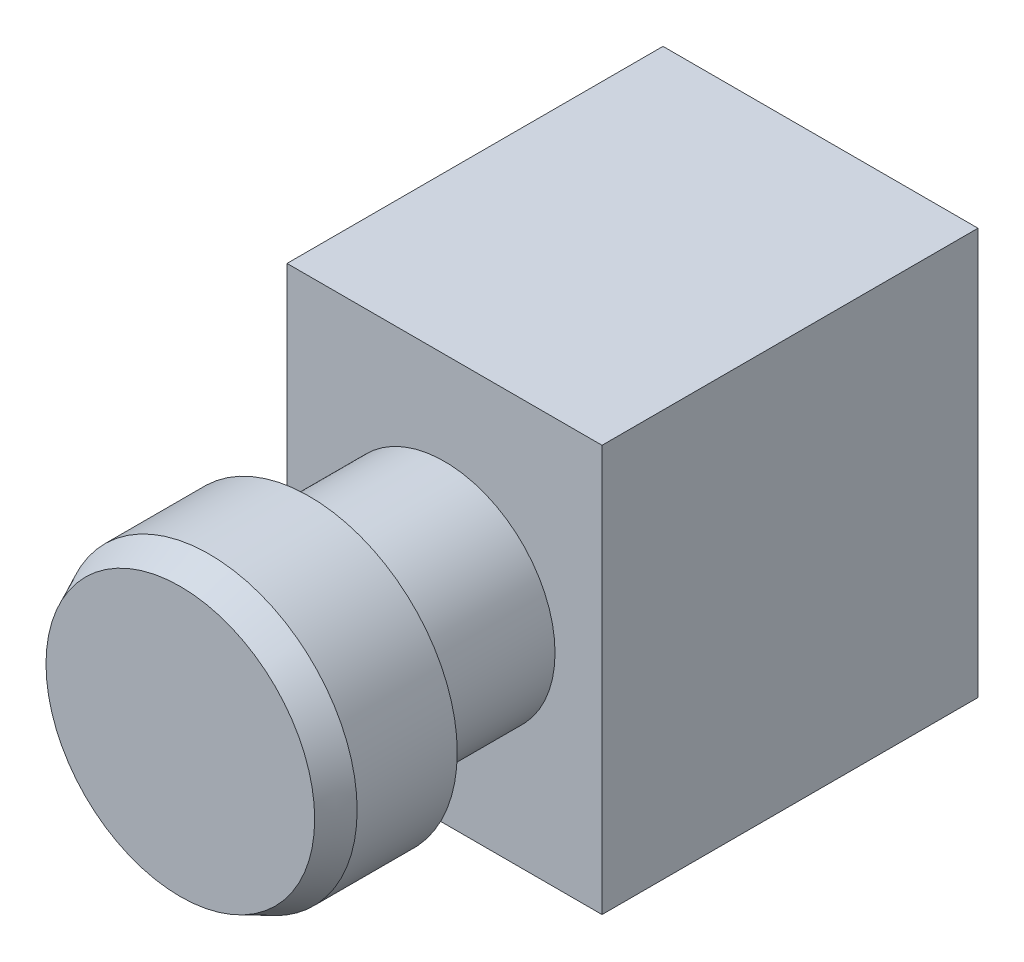
ISO-10303-21;
HEADER;
FILE_DESCRIPTION(('STEP AP214'),'2;1');
FILE_NAME('part.step','',(''),(''),'','','');
FILE_SCHEMA(('AUTOMOTIVE_DESIGN { 1 0 10303 214 1 1 1 1 }'));
ENDSEC;
DATA;
#1=APPLICATION_CONTEXT('core data for automotive mechanical design processes');
#2=APPLICATION_PROTOCOL_DEFINITION('international standard','automotive_design',2000,#1);
#3=PRODUCT_CONTEXT('',#1,'mechanical');
#4=PRODUCT('Part','Part','',(#3));
#5=PRODUCT_RELATED_PRODUCT_CATEGORY('part','',(#4));
#6=PRODUCT_DEFINITION_FORMATION('','',#4);
#7=PRODUCT_DEFINITION_CONTEXT('part definition',#1,'design');
#8=PRODUCT_DEFINITION('design','',#6,#7);
#9=PRODUCT_DEFINITION_SHAPE('','',#8);
#10=(LENGTH_UNIT() NAMED_UNIT(*) SI_UNIT(.MILLI.,.METRE.));
#11=(NAMED_UNIT(*) PLANE_ANGLE_UNIT() SI_UNIT($,.RADIAN.));
#12=(NAMED_UNIT(*) SI_UNIT($,.STERADIAN.) SOLID_ANGLE_UNIT());
#13=UNCERTAINTY_MEASURE_WITH_UNIT(LENGTH_MEASURE(1.E-05),#10,'distance_accuracy_value','');
#14=(GEOMETRIC_REPRESENTATION_CONTEXT(3) GLOBAL_UNCERTAINTY_ASSIGNED_CONTEXT((#13)) GLOBAL_UNIT_ASSIGNED_CONTEXT((#10,
#11,#12)) REPRESENTATION_CONTEXT('',''));
#15=CARTESIAN_POINT('',(0.,0.,0.));
#16=DIRECTION('',(0.,0.,1.));
#17=DIRECTION('',(1.,0.,0.));
#18=AXIS2_PLACEMENT_3D('',#15,#16,#17);
#19=CARTESIAN_POINT('',(0.,0.,9.85));
#20=DIRECTION('',(0.,0.,-1.));
#21=DIRECTION('',(-1.,0.,0.));
#22=AXIS2_PLACEMENT_3D('',#19,#20,#21);
#23=CYLINDRICAL_SURFACE('',#22,14.55);
#24=CARTESIAN_POINT('',(0.,0.,9.85));
#25=DIRECTION('',(0.,0.,1.));
#26=DIRECTION('',(1.,0.,0.));
#27=AXIS2_PLACEMENT_3D('',#24,#25,#26);
#28=CIRCLE('',#27,14.55);
#29=CARTESIAN_POINT('',(14.55,0.,9.85));
#30=VERTEX_POINT('',#29);
#31=EDGE_CURVE('E11',#30,#30,#28,.T.);
#32=ORIENTED_EDGE('',*,*,#31,.F.);
#33=EDGE_LOOP('',(#32));
#34=FACE_BOUND('',#33,.T.);
#35=CARTESIAN_POINT('',(0.,0.,0.));
#36=DIRECTION('',(0.,0.,1.));
#37=DIRECTION('',(1.,0.,0.));
#38=AXIS2_PLACEMENT_3D('',#35,#36,#37);
#39=CIRCLE('',#38,14.55);
#40=CARTESIAN_POINT('',(14.55,0.,0.));
#41=VERTEX_POINT('',#40);
#42=EDGE_CURVE('E49',#41,#41,#39,.T.);
#43=ORIENTED_EDGE('',*,*,#42,.T.);
#44=EDGE_LOOP('',(#43));
#45=FACE_BOUND('',#44,.T.);
#46=ADVANCED_FACE('F50',(#34,#45),#23,.T.);
#47=CARTESIAN_POINT('',(0.,0.,0.));
#48=DIRECTION('',(0.,0.,1.));
#49=DIRECTION('',(1.,0.,0.));
#50=AXIS2_PLACEMENT_3D('',#47,#48,#49);
#51=PLANE('',#50);
#52=CARTESIAN_POINT('',(0.,0.,0.));
#53=DIRECTION('',(0.,0.,1.));
#54=DIRECTION('',(1.,0.,0.));
#55=AXIS2_PLACEMENT_3D('',#52,#53,#54);
#56=CIRCLE('',#55,10.875);
#57=CARTESIAN_POINT('',(10.875,0.,0.));
#58=VERTEX_POINT('',#57);
#59=EDGE_CURVE('E126',#58,#58,#56,.T.);
#60=ORIENTED_EDGE('',*,*,#59,.T.);
#61=EDGE_LOOP('',(#60));
#62=FACE_BOUND('',#61,.T.);
#63=ORIENTED_EDGE('',*,*,#42,.F.);
#64=EDGE_LOOP('',(#63));
#65=FACE_BOUND('',#64,.T.);
#66=ADVANCED_FACE('F139',(#62,#65),#51,.F.);
#67=CARTESIAN_POINT('',(0.,0.,9.85));
#68=DIRECTION('',(0.,0.,-1.));
#69=DIRECTION('',(1.,0.,0.));
#70=AXIS2_PLACEMENT_3D('',#67,#68,#69);
#71=CONICAL_SURFACE('',#70,14.55,0.436332312998583);
#72=CARTESIAN_POINT('',(0.,0.,12.7));
#73=DIRECTION('',(0.,0.,1.));
#74=DIRECTION('',(1.,0.,0.));
#75=AXIS2_PLACEMENT_3D('',#72,#73,#74);
#76=CIRCLE('',#75,13.2210231742583);
#77=CARTESIAN_POINT('',(13.2210231742583,0.,12.7));
#78=VERTEX_POINT('',#77);
#79=EDGE_CURVE('E132',#78,#78,#76,.T.);
#80=ORIENTED_EDGE('',*,*,#79,.F.);
#81=EDGE_LOOP('',(#80));
#82=FACE_BOUND('',#81,.T.);
#83=ORIENTED_EDGE('',*,*,#31,.T.);
#84=EDGE_LOOP('',(#83));
#85=FACE_BOUND('',#84,.T.);
#86=ADVANCED_FACE('F143',(#82,#85),#71,.T.);
#87=CARTESIAN_POINT('',(0.,0.,12.7));
#88=DIRECTION('',(0.,0.,1.));
#89=DIRECTION('',(1.,0.,0.));
#90=AXIS2_PLACEMENT_3D('',#87,#88,#89);
#91=PLANE('',#90);
#92=ORIENTED_EDGE('',*,*,#79,.T.);
#93=EDGE_LOOP('',(#92));
#94=FACE_BOUND('',#93,.T.);
#95=ADVANCED_FACE('F146',(#94),#91,.T.);
#96=CARTESIAN_POINT('',(0.,0.,-13.3));
#97=DIRECTION('',(0.,0.,1.));
#98=DIRECTION('',(1.,0.,0.));
#99=AXIS2_PLACEMENT_3D('',#96,#97,#98);
#100=CYLINDRICAL_SURFACE('',#99,10.875);
#101=CARTESIAN_POINT('',(0.,0.,-13.3));
#102=DIRECTION('',(0.,0.,1.));
#103=DIRECTION('',(1.,0.,0.));
#104=AXIS2_PLACEMENT_3D('',#101,#102,#103);
#105=CIRCLE('',#104,10.875);
#106=CARTESIAN_POINT('',(10.875,0.,-13.3));
#107=VERTEX_POINT('',#106);
#108=EDGE_CURVE('E125',#107,#107,#105,.T.);
#109=ORIENTED_EDGE('',*,*,#108,.T.);
#110=EDGE_LOOP('',(#109));
#111=FACE_BOUND('',#110,.T.);
#112=ORIENTED_EDGE('',*,*,#59,.F.);
#113=EDGE_LOOP('',(#112));
#114=FACE_BOUND('',#113,.T.);
#115=ADVANCED_FACE('F156',(#111,#114),#100,.T.);
#116=CARTESIAN_POINT('',(15.5,-20.,-50.3));
#117=DIRECTION('',(1.,0.,0.));
#118=DIRECTION('',(0.,0.,-1.));
#119=AXIS2_PLACEMENT_3D('',#116,#117,#118);
#120=PLANE('',#119);
#121=DIRECTION('',(0.,1.,0.));
#122=VECTOR('',#121,1.);
#123=CARTESIAN_POINT('',(15.5,-20.,-13.3));
#124=LINE('',#123,#122);
#125=CARTESIAN_POINT('',(15.5,-20.,-13.3));
#126=VERTEX_POINT('',#125);
#127=CARTESIAN_POINT('',(15.5,20.,-13.3));
#128=VERTEX_POINT('',#127);
#129=EDGE_CURVE('E111',#126,#128,#124,.T.);
#130=ORIENTED_EDGE('',*,*,#129,.F.);
#131=DIRECTION('',(0.,0.,1.));
#132=VECTOR('',#131,1.);
#133=CARTESIAN_POINT('',(15.5,-20.,-50.3));
#134=LINE('',#133,#132);
#135=CARTESIAN_POINT('',(15.5,-20.,-50.3));
#136=VERTEX_POINT('',#135);
#137=EDGE_CURVE('E63',#136,#126,#134,.T.);
#138=ORIENTED_EDGE('',*,*,#137,.F.);
#139=DIRECTION('',(0.,1.,0.));
#140=VECTOR('',#139,1.);
#141=CARTESIAN_POINT('',(15.5,-20.,-50.3));
#142=LINE('',#141,#140);
#143=CARTESIAN_POINT('',(15.5,20.,-50.3));
#144=VERTEX_POINT('',#143);
#145=EDGE_CURVE('E107',#136,#144,#142,.T.);
#146=ORIENTED_EDGE('',*,*,#145,.T.);
#147=DIRECTION('',(0.,0.,1.));
#148=VECTOR('',#147,1.);
#149=CARTESIAN_POINT('',(15.5,20.,-50.3));
#150=LINE('',#149,#148);
#151=EDGE_CURVE('E93',#144,#128,#150,.T.);
#152=ORIENTED_EDGE('',*,*,#151,.T.);
#153=EDGE_LOOP('',(#130,#138,#146,#152));
#154=FACE_BOUND('',#153,.T.);
#155=ADVANCED_FACE('F158',(#154),#120,.T.);
#156=CARTESIAN_POINT('',(-15.5,-20.,-50.3));
#157=DIRECTION('',(0.,-1.,0.));
#158=DIRECTION('',(0.,0.,-1.));
#159=AXIS2_PLACEMENT_3D('',#156,#157,#158);
#160=PLANE('',#159);
#161=DIRECTION('',(1.,0.,0.));
#162=VECTOR('',#161,1.);
#163=CARTESIAN_POINT('',(-15.5,-20.,-13.3));
#164=LINE('',#163,#162);
#165=CARTESIAN_POINT('',(-15.5,-20.,-13.3));
#166=VERTEX_POINT('',#165);
#167=EDGE_CURVE('E109',#166,#126,#164,.T.);
#168=ORIENTED_EDGE('',*,*,#167,.F.);
#169=DIRECTION('',(0.,0.,1.));
#170=VECTOR('',#169,1.);
#171=CARTESIAN_POINT('',(-15.5,-20.,-50.3));
#172=LINE('',#171,#170);
#173=CARTESIAN_POINT('',(-15.5,-20.,-50.3));
#174=VERTEX_POINT('',#173);
#175=EDGE_CURVE('E76',#174,#166,#172,.T.);
#176=ORIENTED_EDGE('',*,*,#175,.F.);
#177=DIRECTION('',(1.,0.,0.));
#178=VECTOR('',#177,1.);
#179=CARTESIAN_POINT('',(-15.5,-20.,-50.3));
#180=LINE('',#179,#178);
#181=EDGE_CURVE('E104',#174,#136,#180,.T.);
#182=ORIENTED_EDGE('',*,*,#181,.T.);
#183=ORIENTED_EDGE('',*,*,#137,.T.);
#184=EDGE_LOOP('',(#168,#176,#182,#183));
#185=FACE_BOUND('',#184,.T.);
#186=ADVANCED_FACE('F165',(#185),#160,.T.);
#187=CARTESIAN_POINT('',(-15.5,-20.,-50.3));
#188=DIRECTION('',(-1.,0.,0.));
#189=DIRECTION('',(0.,0.,1.));
#190=AXIS2_PLACEMENT_3D('',#187,#188,#189);
#191=PLANE('',#190);
#192=DIRECTION('',(0.,-1.,0.));
#193=VECTOR('',#192,1.);
#194=CARTESIAN_POINT('',(-15.5,-20.,-13.3));
#195=LINE('',#194,#193);
#196=CARTESIAN_POINT('',(-15.5,20.,-13.3));
#197=VERTEX_POINT('',#196);
#198=EDGE_CURVE('E97',#197,#166,#195,.T.);
#199=ORIENTED_EDGE('',*,*,#198,.F.);
#200=DIRECTION('',(0.,0.,1.));
#201=VECTOR('',#200,1.);
#202=CARTESIAN_POINT('',(-15.5,20.,-50.3));
#203=LINE('',#202,#201);
#204=CARTESIAN_POINT('',(-15.5,20.,-50.3));
#205=VERTEX_POINT('',#204);
#206=EDGE_CURVE('E94',#205,#197,#203,.T.);
#207=ORIENTED_EDGE('',*,*,#206,.F.);
#208=DIRECTION('',(0.,-1.,0.));
#209=VECTOR('',#208,1.);
#210=CARTESIAN_POINT('',(-15.5,-20.,-50.3));
#211=LINE('',#210,#209);
#212=EDGE_CURVE('E100',#205,#174,#211,.T.);
#213=ORIENTED_EDGE('',*,*,#212,.T.);
#214=ORIENTED_EDGE('',*,*,#175,.T.);
#215=EDGE_LOOP('',(#199,#207,#213,#214));
#216=FACE_BOUND('',#215,.T.);
#217=ADVANCED_FACE('F96',(#216),#191,.T.);
#218=CARTESIAN_POINT('',(-15.5,20.,-50.3));
#219=DIRECTION('',(0.,1.,0.));
#220=DIRECTION('',(0.,0.,1.));
#221=AXIS2_PLACEMENT_3D('',#218,#219,#220);
#222=PLANE('',#221);
#223=DIRECTION('',(-1.,0.,0.));
#224=VECTOR('',#223,1.);
#225=CARTESIAN_POINT('',(-15.5,20.,-13.3));
#226=LINE('',#225,#224);
#227=EDGE_CURVE('E120',#128,#197,#226,.T.);
#228=ORIENTED_EDGE('',*,*,#227,.F.);
#229=ORIENTED_EDGE('',*,*,#151,.F.);
#230=DIRECTION('',(-1.,0.,0.));
#231=VECTOR('',#230,1.);
#232=CARTESIAN_POINT('',(-15.5,20.,-50.3));
#233=LINE('',#232,#231);
#234=EDGE_CURVE('E102',#144,#205,#233,.T.);
#235=ORIENTED_EDGE('',*,*,#234,.T.);
#236=ORIENTED_EDGE('',*,*,#206,.T.);
#237=EDGE_LOOP('',(#228,#229,#235,#236));
#238=FACE_BOUND('',#237,.T.);
#239=ADVANCED_FACE('F110',(#238),#222,.T.);
#240=CARTESIAN_POINT('',(0.,0.,-50.3));
#241=DIRECTION('',(0.,0.,-1.));
#242=DIRECTION('',(-1.,0.,0.));
#243=AXIS2_PLACEMENT_3D('',#240,#241,#242);
#244=PLANE('',#243);
#245=ORIENTED_EDGE('',*,*,#145,.F.);
#246=ORIENTED_EDGE('',*,*,#181,.F.);
#247=ORIENTED_EDGE('',*,*,#212,.F.);
#248=ORIENTED_EDGE('',*,*,#234,.F.);
#249=EDGE_LOOP('',(#245,#246,#247,#248));
#250=FACE_BOUND('',#249,.T.);
#251=ADVANCED_FACE('F103',(#250),#244,.T.);
#252=CARTESIAN_POINT('',(0.,0.,-13.3));
#253=DIRECTION('',(0.,0.,-1.));
#254=DIRECTION('',(-1.,0.,0.));
#255=AXIS2_PLACEMENT_3D('',#252,#253,#254);
#256=PLANE('',#255);
#257=ORIENTED_EDGE('',*,*,#108,.F.);
#258=EDGE_LOOP('',(#257));
#259=FACE_BOUND('',#258,.T.);
#260=ORIENTED_EDGE('',*,*,#129,.T.);
#261=ORIENTED_EDGE('',*,*,#227,.T.);
#262=ORIENTED_EDGE('',*,*,#198,.T.);
#263=ORIENTED_EDGE('',*,*,#167,.T.);
#264=EDGE_LOOP('',(#260,#261,#262,#263));
#265=FACE_BOUND('',#264,.T.);
#266=ADVANCED_FACE('F166',(#259,#265),#256,.F.);
#267=CLOSED_SHELL('',(#46,#66,#86,#95,#115,#155,#186,#217,#239,#251,#266));
#268=MANIFOLD_SOLID_BREP('B2',#267);
#269=ADVANCED_BREP_SHAPE_REPRESENTATION('',(#18,#268),#14);
#270=SHAPE_DEFINITION_REPRESENTATION(#9,#269);
ENDSEC;
END-ISO-10303-21;
